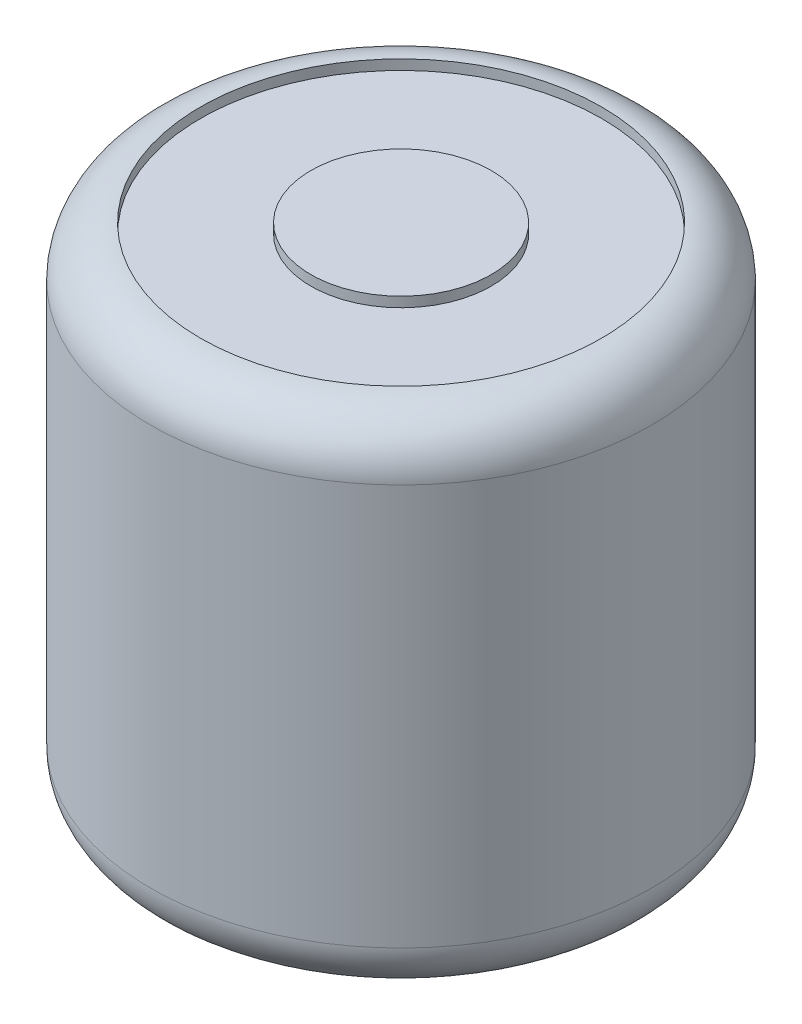
ISO-10303-21;
HEADER;
FILE_DESCRIPTION(('STEP AP214'),'2;1');
FILE_NAME('part.step','',(''),(''),'','','');
FILE_SCHEMA(('AUTOMOTIVE_DESIGN { 1 0 10303 214 1 1 1 1 }'));
ENDSEC;
DATA;
#1=APPLICATION_CONTEXT('core data for automotive mechanical design processes');
#2=APPLICATION_PROTOCOL_DEFINITION('international standard','automotive_design',2000,#1);
#3=PRODUCT_CONTEXT('',#1,'mechanical');
#4=PRODUCT('Part','Part','',(#3));
#5=PRODUCT_RELATED_PRODUCT_CATEGORY('part','',(#4));
#6=PRODUCT_DEFINITION_FORMATION('','',#4);
#7=PRODUCT_DEFINITION_CONTEXT('part definition',#1,'design');
#8=PRODUCT_DEFINITION('design','',#6,#7);
#9=PRODUCT_DEFINITION_SHAPE('','',#8);
#10=(LENGTH_UNIT() NAMED_UNIT(*) SI_UNIT(.MILLI.,.METRE.));
#11=(NAMED_UNIT(*) PLANE_ANGLE_UNIT() SI_UNIT($,.RADIAN.));
#12=(NAMED_UNIT(*) SI_UNIT($,.STERADIAN.) SOLID_ANGLE_UNIT());
#13=UNCERTAINTY_MEASURE_WITH_UNIT(LENGTH_MEASURE(1.E-05),#10,'distance_accuracy_value','');
#14=(GEOMETRIC_REPRESENTATION_CONTEXT(3) GLOBAL_UNCERTAINTY_ASSIGNED_CONTEXT((#13)) GLOBAL_UNIT_ASSIGNED_CONTEXT((#10,
#11,#12)) REPRESENTATION_CONTEXT('',''));
#15=CARTESIAN_POINT('',(0.,0.,0.));
#16=DIRECTION('',(0.,0.,1.));
#17=DIRECTION('',(1.,0.,0.));
#18=AXIS2_PLACEMENT_3D('',#15,#16,#17);
#19=CARTESIAN_POINT('',(0.,10.,0.));
#20=DIRECTION('',(0.,-1.,0.));
#21=DIRECTION('',(0.,0.,1.));
#22=AXIS2_PLACEMENT_3D('',#19,#20,#21);
#23=CYLINDRICAL_SURFACE('',#22,5.);
#24=CARTESIAN_POINT('',(0.,9.,0.));
#25=DIRECTION('',(0.,-1.,0.));
#26=DIRECTION('',(0.,0.,-1.));
#27=AXIS2_PLACEMENT_3D('',#24,#25,#26);
#28=CIRCLE('',#27,5.);
#29=CARTESIAN_POINT('',(0.,9.,-5.));
#30=VERTEX_POINT('',#29);
#31=EDGE_CURVE('E48',#30,#30,#28,.F.);
#32=ORIENTED_EDGE('',*,*,#31,.F.);
#33=EDGE_LOOP('',(#32));
#34=FACE_BOUND('',#33,.T.);
#35=CARTESIAN_POINT('',(0.,0.999999999999999,0.));
#36=DIRECTION('',(0.,-1.,0.));
#37=DIRECTION('',(0.,0.,-1.));
#38=AXIS2_PLACEMENT_3D('',#35,#36,#37);
#39=CIRCLE('',#38,5.);
#40=CARTESIAN_POINT('',(0.,0.999999999999999,-5.));
#41=VERTEX_POINT('',#40);
#42=EDGE_CURVE('E55',#41,#41,#39,.T.);
#43=ORIENTED_EDGE('',*,*,#42,.F.);
#44=EDGE_LOOP('',(#43));
#45=FACE_BOUND('',#44,.T.);
#46=ADVANCED_FACE('F41',(#34,#45),#23,.T.);
#47=CARTESIAN_POINT('',(0.,0.,0.));
#48=DIRECTION('',(0.,1.,0.));
#49=DIRECTION('',(0.,0.,-1.));
#50=AXIS2_PLACEMENT_3D('',#47,#48,#49);
#51=PLANE('',#50);
#52=CARTESIAN_POINT('',(0.,0.,0.));
#53=DIRECTION('',(0.,1.,0.));
#54=DIRECTION('',(0.,0.,1.));
#55=AXIS2_PLACEMENT_3D('',#52,#53,#54);
#56=CIRCLE('',#55,1.);
#57=CARTESIAN_POINT('',(0.,0.,1.));
#58=VERTEX_POINT('',#57);
#59=EDGE_CURVE('E71',#58,#58,#56,.T.);
#60=ORIENTED_EDGE('',*,*,#59,.T.);
#61=EDGE_LOOP('',(#60));
#62=FACE_BOUND('',#61,.T.);
#63=CARTESIAN_POINT('',(0.,0.,0.));
#64=DIRECTION('',(0.,-1.,0.));
#65=DIRECTION('',(0.,0.,-1.));
#66=AXIS2_PLACEMENT_3D('',#63,#64,#65);
#67=CIRCLE('',#66,4.);
#68=CARTESIAN_POINT('',(0.,0.,-4.));
#69=VERTEX_POINT('',#68);
#70=EDGE_CURVE('E10',#69,#69,#67,.F.);
#71=ORIENTED_EDGE('',*,*,#70,.F.);
#72=EDGE_LOOP('',(#71));
#73=FACE_BOUND('',#72,.T.);
#74=ADVANCED_FACE('F87',(#62,#73),#51,.F.);
#75=CARTESIAN_POINT('',(0.,9.8,0.));
#76=DIRECTION('',(0.,1.,0.));
#77=DIRECTION('',(0.,0.,-1.));
#78=AXIS2_PLACEMENT_3D('',#75,#76,#77);
#79=CYLINDRICAL_SURFACE('',#78,4.);
#80=CARTESIAN_POINT('',(0.,9.8,0.));
#81=DIRECTION('',(0.,-1.,0.));
#82=DIRECTION('',(0.,0.,-1.));
#83=AXIS2_PLACEMENT_3D('',#80,#81,#82);
#84=CIRCLE('',#83,4.);
#85=CARTESIAN_POINT('',(0.,9.8,-4.));
#86=VERTEX_POINT('',#85);
#87=EDGE_CURVE('E57',#86,#86,#84,.T.);
#88=ORIENTED_EDGE('',*,*,#87,.T.);
#89=EDGE_LOOP('',(#88));
#90=FACE_BOUND('',#89,.T.);
#91=CARTESIAN_POINT('',(0.,10.,0.));
#92=DIRECTION('',(0.,-1.,0.));
#93=DIRECTION('',(0.,0.,-1.));
#94=AXIS2_PLACEMENT_3D('',#91,#92,#93);
#95=CIRCLE('',#94,4.);
#96=CARTESIAN_POINT('',(0.,10.,-4.));
#97=VERTEX_POINT('',#96);
#98=EDGE_CURVE('E56',#97,#97,#95,.T.);
#99=ORIENTED_EDGE('',*,*,#98,.F.);
#100=EDGE_LOOP('',(#99));
#101=FACE_BOUND('',#100,.T.);
#102=ADVANCED_FACE('F100',(#90,#101),#79,.F.);
#103=CARTESIAN_POINT('',(0.,9.8,0.));
#104=DIRECTION('',(0.,1.,0.));
#105=DIRECTION('',(0.,0.,-1.));
#106=AXIS2_PLACEMENT_3D('',#103,#104,#105);
#107=PLANE('',#106);
#108=CARTESIAN_POINT('',(0.,9.8,0.));
#109=DIRECTION('',(0.,-1.,0.));
#110=DIRECTION('',(0.,0.,-1.));
#111=AXIS2_PLACEMENT_3D('',#108,#109,#110);
#112=CIRCLE('',#111,1.8);
#113=CARTESIAN_POINT('',(0.,9.8,-1.8));
#114=VERTEX_POINT('',#113);
#115=EDGE_CURVE('E62',#114,#114,#112,.T.);
#116=ORIENTED_EDGE('',*,*,#115,.T.);
#117=EDGE_LOOP('',(#116));
#118=FACE_BOUND('',#117,.T.);
#119=ORIENTED_EDGE('',*,*,#87,.F.);
#120=EDGE_LOOP('',(#119));
#121=FACE_BOUND('',#120,.T.);
#122=ADVANCED_FACE('F111',(#118,#121),#107,.T.);
#123=CARTESIAN_POINT('',(0.,9.8,0.));
#124=DIRECTION('',(0.,1.,0.));
#125=DIRECTION('',(0.,0.,-1.));
#126=AXIS2_PLACEMENT_3D('',#123,#124,#125);
#127=CYLINDRICAL_SURFACE('',#126,1.8);
#128=ORIENTED_EDGE('',*,*,#115,.F.);
#129=EDGE_LOOP('',(#128));
#130=FACE_BOUND('',#129,.T.);
#131=CARTESIAN_POINT('',(0.,10.,0.));
#132=DIRECTION('',(0.,-1.,0.));
#133=DIRECTION('',(0.,0.,-1.));
#134=AXIS2_PLACEMENT_3D('',#131,#132,#133);
#135=CIRCLE('',#134,1.8);
#136=CARTESIAN_POINT('',(0.,10.,-1.8));
#137=VERTEX_POINT('',#136);
#138=EDGE_CURVE('E65',#137,#137,#135,.T.);
#139=ORIENTED_EDGE('',*,*,#138,.T.);
#140=EDGE_LOOP('',(#139));
#141=FACE_BOUND('',#140,.T.);
#142=ADVANCED_FACE('F109',(#130,#141),#127,.T.);
#143=CARTESIAN_POINT('',(0.,10.,0.));
#144=DIRECTION('',(0.,1.,0.));
#145=DIRECTION('',(0.,0.,-1.));
#146=AXIS2_PLACEMENT_3D('',#143,#144,#145);
#147=PLANE('',#146);
#148=ORIENTED_EDGE('',*,*,#138,.F.);
#149=EDGE_LOOP('',(#148));
#150=FACE_BOUND('',#149,.T.);
#151=ADVANCED_FACE('F104',(#150),#147,.T.);
#152=CARTESIAN_POINT('',(0.,9.,0.));
#153=DIRECTION('',(0.,1.,0.));
#154=DIRECTION('',(0.,0.,-1.));
#155=AXIS2_PLACEMENT_3D('',#152,#153,#154);
#156=TOROIDAL_SURFACE('',#155,4.,1.);
#157=ORIENTED_EDGE('',*,*,#31,.T.);
#158=EDGE_LOOP('',(#157));
#159=FACE_BOUND('',#158,.T.);
#160=ORIENTED_EDGE('',*,*,#98,.T.);
#161=EDGE_LOOP('',(#160));
#162=FACE_BOUND('',#161,.T.);
#163=ADVANCED_FACE('F105',(#159,#162),#156,.T.);
#164=CARTESIAN_POINT('',(0.,0.999999999999999,0.));
#165=DIRECTION('',(0.,1.,0.));
#166=DIRECTION('',(0.,0.,-1.));
#167=AXIS2_PLACEMENT_3D('',#164,#165,#166);
#168=TOROIDAL_SURFACE('',#167,4.,1.);
#169=ORIENTED_EDGE('',*,*,#70,.T.);
#170=EDGE_LOOP('',(#169));
#171=FACE_BOUND('',#170,.T.);
#172=ORIENTED_EDGE('',*,*,#42,.T.);
#173=EDGE_LOOP('',(#172));
#174=FACE_BOUND('',#173,.T.);
#175=ADVANCED_FACE('F43',(#171,#174),#168,.T.);
#176=CARTESIAN_POINT('',(0.,3.,0.));
#177=DIRECTION('',(0.,-1.,0.));
#178=DIRECTION('',(0.,0.,1.));
#179=AXIS2_PLACEMENT_3D('',#176,#177,#178);
#180=CYLINDRICAL_SURFACE('',#179,1.);
#181=CARTESIAN_POINT('',(0.,3.,0.));
#182=DIRECTION('',(0.,1.,0.));
#183=DIRECTION('',(0.,0.,1.));
#184=AXIS2_PLACEMENT_3D('',#181,#182,#183);
#185=CIRCLE('',#184,1.);
#186=CARTESIAN_POINT('',(0.,3.,1.));
#187=VERTEX_POINT('',#186);
#188=EDGE_CURVE('E66',#187,#187,#185,.T.);
#189=ORIENTED_EDGE('',*,*,#188,.T.);
#190=EDGE_LOOP('',(#189));
#191=FACE_BOUND('',#190,.T.);
#192=ORIENTED_EDGE('',*,*,#59,.F.);
#193=EDGE_LOOP('',(#192));
#194=FACE_BOUND('',#193,.T.);
#195=ADVANCED_FACE('F77',(#191,#194),#180,.F.);
#196=CARTESIAN_POINT('',(0.,3.,0.));
#197=DIRECTION('',(0.,-1.,0.));
#198=DIRECTION('',(0.,0.,1.));
#199=AXIS2_PLACEMENT_3D('',#196,#197,#198);
#200=PLANE('',#199);
#201=ORIENTED_EDGE('',*,*,#188,.F.);
#202=EDGE_LOOP('',(#201));
#203=FACE_BOUND('',#202,.T.);
#204=ADVANCED_FACE('F79',(#203),#200,.T.);
#205=CLOSED_SHELL('',(#46,#74,#102,#122,#142,#151,#163,#175,#195,#204));
#206=MANIFOLD_SOLID_BREP('B2',#205);
#207=ADVANCED_BREP_SHAPE_REPRESENTATION('',(#18,#206),#14);
#208=SHAPE_DEFINITION_REPRESENTATION(#9,#207);
ENDSEC;
END-ISO-10303-21;
